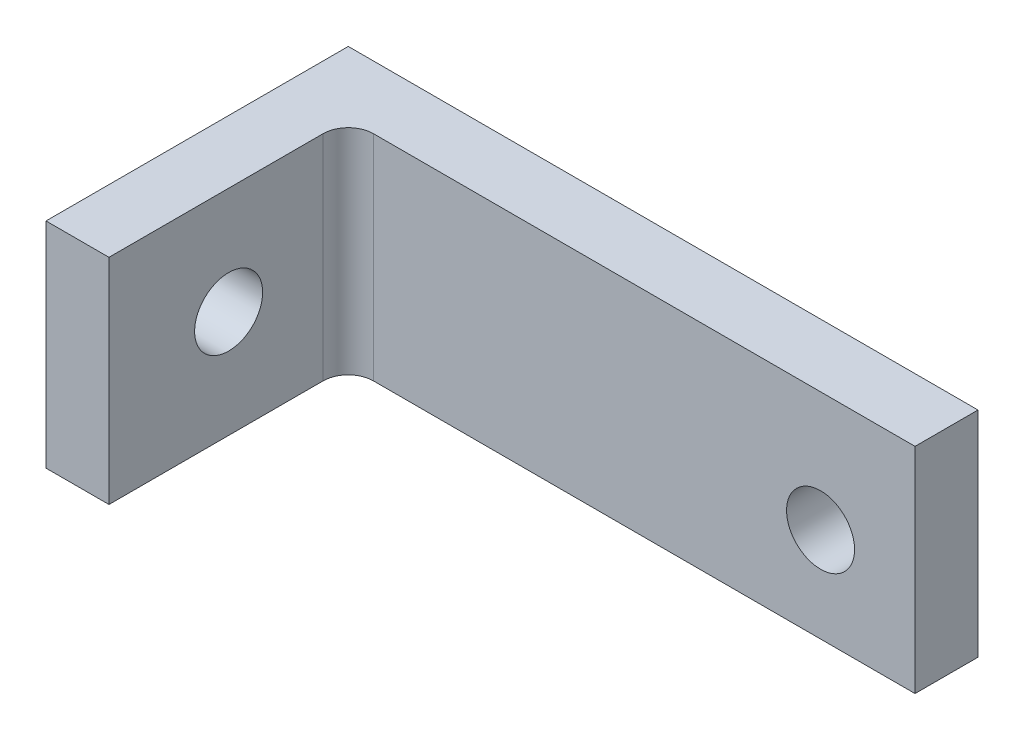
ISO-10303-21;
HEADER;
FILE_DESCRIPTION(('STEP AP214'),'2;1');
FILE_NAME('part.step','',(''),(''),'','','');
FILE_SCHEMA(('AUTOMOTIVE_DESIGN { 1 0 10303 214 1 1 1 1 }'));
ENDSEC;
DATA;
#1=APPLICATION_CONTEXT('core data for automotive mechanical design processes');
#2=APPLICATION_PROTOCOL_DEFINITION('international standard','automotive_design',2000,#1);
#3=PRODUCT_CONTEXT('',#1,'mechanical');
#4=PRODUCT('Part','Part','',(#3));
#5=PRODUCT_RELATED_PRODUCT_CATEGORY('part','',(#4));
#6=PRODUCT_DEFINITION_FORMATION('','',#4);
#7=PRODUCT_DEFINITION_CONTEXT('part definition',#1,'design');
#8=PRODUCT_DEFINITION('design','',#6,#7);
#9=PRODUCT_DEFINITION_SHAPE('','',#8);
#10=(LENGTH_UNIT() NAMED_UNIT(*) SI_UNIT(.MILLI.,.METRE.));
#11=(NAMED_UNIT(*) PLANE_ANGLE_UNIT() SI_UNIT($,.RADIAN.));
#12=(NAMED_UNIT(*) SI_UNIT($,.STERADIAN.) SOLID_ANGLE_UNIT());
#13=UNCERTAINTY_MEASURE_WITH_UNIT(LENGTH_MEASURE(1.E-05),#10,'distance_accuracy_value','');
#14=(GEOMETRIC_REPRESENTATION_CONTEXT(3) GLOBAL_UNCERTAINTY_ASSIGNED_CONTEXT((#13)) GLOBAL_UNIT_ASSIGNED_CONTEXT((#10,
#11,#12)) REPRESENTATION_CONTEXT('',''));
#15=CARTESIAN_POINT('',(0.,0.,0.));
#16=DIRECTION('',(0.,0.,1.));
#17=DIRECTION('',(1.,0.,0.));
#18=AXIS2_PLACEMENT_3D('',#15,#16,#17);
#19=CARTESIAN_POINT('',(-25.,17.,0.));
#20=DIRECTION('',(1.,0.,0.));
#21=DIRECTION('',(0.,0.,-1.));
#22=AXIS2_PLACEMENT_3D('',#19,#20,#21);
#23=PLANE('',#22);
#24=CARTESIAN_POINT('',(-25.,8.5,14.5));
#25=DIRECTION('',(1.,0.,0.));
#26=DIRECTION('',(0.,0.,-1.));
#27=AXIS2_PLACEMENT_3D('',#24,#25,#26);
#28=CIRCLE('',#27,2.7);
#29=CARTESIAN_POINT('',(-25.,8.5,11.8));
#30=VERTEX_POINT('',#29);
#31=EDGE_CURVE('E146',#30,#30,#28,.T.);
#32=ORIENTED_EDGE('',*,*,#31,.T.);
#33=EDGE_LOOP('',(#32));
#34=FACE_BOUND('',#33,.T.);
#35=DIRECTION('',(0.,0.,1.));
#36=VECTOR('',#35,1.);
#37=CARTESIAN_POINT('',(-25.,0.,0.));
#38=LINE('',#37,#36);
#39=CARTESIAN_POINT('',(-25.,0.,0.));
#40=VERTEX_POINT('',#39);
#41=CARTESIAN_POINT('',(-25.,0.,24.));
#42=VERTEX_POINT('',#41);
#43=EDGE_CURVE('E120',#40,#42,#38,.T.);
#44=ORIENTED_EDGE('',*,*,#43,.T.);
#45=DIRECTION('',(0.,-1.,0.));
#46=VECTOR('',#45,1.);
#47=CARTESIAN_POINT('',(-25.,17.,24.));
#48=LINE('',#47,#46);
#49=CARTESIAN_POINT('',(-25.,17.,24.));
#50=VERTEX_POINT('',#49);
#51=EDGE_CURVE('E102',#50,#42,#48,.T.);
#52=ORIENTED_EDGE('',*,*,#51,.F.);
#53=DIRECTION('',(0.,0.,1.));
#54=VECTOR('',#53,1.);
#55=CARTESIAN_POINT('',(-25.,17.,0.));
#56=LINE('',#55,#54);
#57=CARTESIAN_POINT('',(-25.,17.,0.));
#58=VERTEX_POINT('',#57);
#59=EDGE_CURVE('E108',#58,#50,#56,.T.);
#60=ORIENTED_EDGE('',*,*,#59,.F.);
#61=DIRECTION('',(0.,-1.,0.));
#62=VECTOR('',#61,1.);
#63=CARTESIAN_POINT('',(-25.,17.,0.));
#64=LINE('',#63,#62);
#65=EDGE_CURVE('E134',#58,#40,#64,.T.);
#66=ORIENTED_EDGE('',*,*,#65,.T.);
#67=EDGE_LOOP('',(#44,#52,#60,#66));
#68=FACE_BOUND('',#67,.T.);
#69=ADVANCED_FACE('F39',(#34,#68),#23,.F.);
#70=CARTESIAN_POINT('',(-25.,17.,24.));
#71=DIRECTION('',(0.,0.,-1.));
#72=DIRECTION('',(-1.,0.,0.));
#73=AXIS2_PLACEMENT_3D('',#70,#71,#72);
#74=PLANE('',#73);
#75=DIRECTION('',(1.,0.,0.));
#76=VECTOR('',#75,1.);
#77=CARTESIAN_POINT('',(-25.,0.,24.));
#78=LINE('',#77,#76);
#79=CARTESIAN_POINT('',(-20.,0.,24.));
#80=VERTEX_POINT('',#79);
#81=EDGE_CURVE('E143',#42,#80,#78,.T.);
#82=ORIENTED_EDGE('',*,*,#81,.T.);
#83=DIRECTION('',(0.,-1.,0.));
#84=VECTOR('',#83,1.);
#85=CARTESIAN_POINT('',(-20.,17.,24.));
#86=LINE('',#85,#84);
#87=CARTESIAN_POINT('',(-20.,17.,24.));
#88=VERTEX_POINT('',#87);
#89=EDGE_CURVE('E105',#88,#80,#86,.T.);
#90=ORIENTED_EDGE('',*,*,#89,.F.);
#91=DIRECTION('',(1.,0.,0.));
#92=VECTOR('',#91,1.);
#93=CARTESIAN_POINT('',(-25.,17.,24.));
#94=LINE('',#93,#92);
#95=EDGE_CURVE('E98',#50,#88,#94,.T.);
#96=ORIENTED_EDGE('',*,*,#95,.F.);
#97=ORIENTED_EDGE('',*,*,#51,.T.);
#98=EDGE_LOOP('',(#82,#90,#96,#97));
#99=FACE_BOUND('',#98,.T.);
#100=ADVANCED_FACE('F100',(#99),#74,.F.);
#101=CARTESIAN_POINT('',(-20.,17.,24.));
#102=DIRECTION('',(-1.,0.,0.));
#103=DIRECTION('',(0.,0.,1.));
#104=AXIS2_PLACEMENT_3D('',#101,#102,#103);
#105=PLANE('',#104);
#106=CARTESIAN_POINT('',(-20.,8.5,14.5));
#107=DIRECTION('',(1.,0.,0.));
#108=DIRECTION('',(0.,0.,-1.));
#109=AXIS2_PLACEMENT_3D('',#106,#107,#108);
#110=CIRCLE('',#109,2.7);
#111=CARTESIAN_POINT('',(-20.,8.5,11.8));
#112=VERTEX_POINT('',#111);
#113=EDGE_CURVE('E153',#112,#112,#110,.T.);
#114=ORIENTED_EDGE('',*,*,#113,.F.);
#115=EDGE_LOOP('',(#114));
#116=FACE_BOUND('',#115,.T.);
#117=DIRECTION('',(0.,0.,-1.));
#118=VECTOR('',#117,1.);
#119=CARTESIAN_POINT('',(-20.,0.,24.));
#120=LINE('',#119,#118);
#121=CARTESIAN_POINT('',(-20.,0.,7.));
#122=VERTEX_POINT('',#121);
#123=EDGE_CURVE('E141',#80,#122,#120,.T.);
#124=ORIENTED_EDGE('',*,*,#123,.T.);
#125=DIRECTION('',(0.,-1.,0.));
#126=VECTOR('',#125,1.);
#127=CARTESIAN_POINT('',(-20.,17.,7.));
#128=LINE('',#127,#126);
#129=CARTESIAN_POINT('',(-20.,17.,7.));
#130=VERTEX_POINT('',#129);
#131=EDGE_CURVE('E54',#122,#130,#128,.F.);
#132=ORIENTED_EDGE('',*,*,#131,.T.);
#133=DIRECTION('',(0.,0.,-1.));
#134=VECTOR('',#133,1.);
#135=CARTESIAN_POINT('',(-20.,17.,24.));
#136=LINE('',#135,#134);
#137=EDGE_CURVE('E107',#88,#130,#136,.T.);
#138=ORIENTED_EDGE('',*,*,#137,.F.);
#139=ORIENTED_EDGE('',*,*,#89,.T.);
#140=EDGE_LOOP('',(#124,#132,#138,#139));
#141=FACE_BOUND('',#140,.T.);
#142=ADVANCED_FACE('F179',(#116,#141),#105,.F.);
#143=CARTESIAN_POINT('',(-20.,17.,5.));
#144=DIRECTION('',(0.,0.,-1.));
#145=DIRECTION('',(-1.,0.,0.));
#146=AXIS2_PLACEMENT_3D('',#143,#144,#145);
#147=PLANE('',#146);
#148=CARTESIAN_POINT('',(17.5,7.5,5.));
#149=DIRECTION('',(0.,0.,1.));
#150=DIRECTION('',(1.,0.,0.));
#151=AXIS2_PLACEMENT_3D('',#148,#149,#150);
#152=CIRCLE('',#151,2.7);
#153=CARTESIAN_POINT('',(20.2,7.5,5.));
#154=VERTEX_POINT('',#153);
#155=EDGE_CURVE('E159',#154,#154,#152,.T.);
#156=ORIENTED_EDGE('',*,*,#155,.F.);
#157=EDGE_LOOP('',(#156));
#158=FACE_BOUND('',#157,.T.);
#159=DIRECTION('',(1.,0.,0.));
#160=VECTOR('',#159,1.);
#161=CARTESIAN_POINT('',(-20.,17.,5.));
#162=LINE('',#161,#160);
#163=CARTESIAN_POINT('',(-18.,17.,5.));
#164=VERTEX_POINT('',#163);
#165=CARTESIAN_POINT('',(25.,17.,5.));
#166=VERTEX_POINT('',#165);
#167=EDGE_CURVE('E150',#164,#166,#162,.T.);
#168=ORIENTED_EDGE('',*,*,#167,.F.);
#169=DIRECTION('',(0.,-1.,0.));
#170=VECTOR('',#169,1.);
#171=CARTESIAN_POINT('',(-18.,0.,5.));
#172=LINE('',#171,#170);
#173=CARTESIAN_POINT('',(-18.,0.,5.));
#174=VERTEX_POINT('',#173);
#175=EDGE_CURVE('E121',#164,#174,#172,.T.);
#176=ORIENTED_EDGE('',*,*,#175,.T.);
#177=DIRECTION('',(1.,0.,0.));
#178=VECTOR('',#177,1.);
#179=CARTESIAN_POINT('',(-20.,0.,5.));
#180=LINE('',#179,#178);
#181=CARTESIAN_POINT('',(25.,0.,5.));
#182=VERTEX_POINT('',#181);
#183=EDGE_CURVE('E139',#174,#182,#180,.T.);
#184=ORIENTED_EDGE('',*,*,#183,.T.);
#185=DIRECTION('',(0.,-1.,0.));
#186=VECTOR('',#185,1.);
#187=CARTESIAN_POINT('',(25.,17.,5.));
#188=LINE('',#187,#186);
#189=EDGE_CURVE('E125',#166,#182,#188,.T.);
#190=ORIENTED_EDGE('',*,*,#189,.F.);
#191=EDGE_LOOP('',(#168,#176,#184,#190));
#192=FACE_BOUND('',#191,.T.);
#193=ADVANCED_FACE('F175',(#158,#192),#147,.F.);
#194=CARTESIAN_POINT('',(25.,17.,0.));
#195=DIRECTION('',(-1.,0.,0.));
#196=DIRECTION('',(0.,0.,1.));
#197=AXIS2_PLACEMENT_3D('',#194,#195,#196);
#198=PLANE('',#197);
#199=DIRECTION('',(0.,0.,-1.));
#200=VECTOR('',#199,1.);
#201=CARTESIAN_POINT('',(25.,0.,0.));
#202=LINE('',#201,#200);
#203=CARTESIAN_POINT('',(25.,0.,0.));
#204=VERTEX_POINT('',#203);
#205=EDGE_CURVE('E137',#182,#204,#202,.T.);
#206=ORIENTED_EDGE('',*,*,#205,.T.);
#207=DIRECTION('',(0.,-1.,0.));
#208=VECTOR('',#207,1.);
#209=CARTESIAN_POINT('',(25.,17.,0.));
#210=LINE('',#209,#208);
#211=CARTESIAN_POINT('',(25.,17.,0.));
#212=VERTEX_POINT('',#211);
#213=EDGE_CURVE('E131',#212,#204,#210,.T.);
#214=ORIENTED_EDGE('',*,*,#213,.F.);
#215=DIRECTION('',(0.,0.,-1.));
#216=VECTOR('',#215,1.);
#217=CARTESIAN_POINT('',(25.,17.,0.));
#218=LINE('',#217,#216);
#219=EDGE_CURVE('E148',#166,#212,#218,.T.);
#220=ORIENTED_EDGE('',*,*,#219,.F.);
#221=ORIENTED_EDGE('',*,*,#189,.T.);
#222=EDGE_LOOP('',(#206,#214,#220,#221));
#223=FACE_BOUND('',#222,.T.);
#224=ADVANCED_FACE('F178',(#223),#198,.F.);
#225=CARTESIAN_POINT('',(-25.,17.,0.));
#226=DIRECTION('',(0.,0.,1.));
#227=DIRECTION('',(1.,0.,0.));
#228=AXIS2_PLACEMENT_3D('',#225,#226,#227);
#229=PLANE('',#228);
#230=CARTESIAN_POINT('',(17.5,7.5,0.));
#231=DIRECTION('',(0.,0.,1.));
#232=DIRECTION('',(1.,0.,0.));
#233=AXIS2_PLACEMENT_3D('',#230,#231,#232);
#234=CIRCLE('',#233,2.7);
#235=CARTESIAN_POINT('',(20.2,7.5,0.));
#236=VERTEX_POINT('',#235);
#237=EDGE_CURVE('E156',#236,#236,#234,.T.);
#238=ORIENTED_EDGE('',*,*,#237,.T.);
#239=EDGE_LOOP('',(#238));
#240=FACE_BOUND('',#239,.T.);
#241=DIRECTION('',(-1.,0.,0.));
#242=VECTOR('',#241,1.);
#243=CARTESIAN_POINT('',(-25.,0.,0.));
#244=LINE('',#243,#242);
#245=EDGE_CURVE('E117',#204,#40,#244,.T.);
#246=ORIENTED_EDGE('',*,*,#245,.T.);
#247=ORIENTED_EDGE('',*,*,#65,.F.);
#248=DIRECTION('',(-1.,0.,0.));
#249=VECTOR('',#248,1.);
#250=CARTESIAN_POINT('',(-25.,17.,0.));
#251=LINE('',#250,#249);
#252=EDGE_CURVE('E113',#212,#58,#251,.T.);
#253=ORIENTED_EDGE('',*,*,#252,.F.);
#254=ORIENTED_EDGE('',*,*,#213,.T.);
#255=EDGE_LOOP('',(#246,#247,#253,#254));
#256=FACE_BOUND('',#255,.T.);
#257=ADVANCED_FACE('F165',(#240,#256),#229,.F.);
#258=CARTESIAN_POINT('',(0.,17.,0.));
#259=DIRECTION('',(0.,1.,0.));
#260=DIRECTION('',(0.,0.,1.));
#261=AXIS2_PLACEMENT_3D('',#258,#259,#260);
#262=PLANE('',#261);
#263=ORIENTED_EDGE('',*,*,#59,.T.);
#264=ORIENTED_EDGE('',*,*,#95,.T.);
#265=ORIENTED_EDGE('',*,*,#137,.T.);
#266=CARTESIAN_POINT('',(-18.,17.,7.));
#267=DIRECTION('',(0.,1.,0.));
#268=DIRECTION('',(0.,0.,1.));
#269=AXIS2_PLACEMENT_3D('',#266,#267,#268);
#270=CIRCLE('',#269,2.);
#271=EDGE_CURVE('E11',#130,#164,#270,.F.);
#272=ORIENTED_EDGE('',*,*,#271,.T.);
#273=ORIENTED_EDGE('',*,*,#167,.T.);
#274=ORIENTED_EDGE('',*,*,#219,.T.);
#275=ORIENTED_EDGE('',*,*,#252,.T.);
#276=EDGE_LOOP('',(#263,#264,#265,#272,#273,#274,#275));
#277=FACE_BOUND('',#276,.T.);
#278=ADVANCED_FACE('F111',(#277),#262,.T.);
#279=CARTESIAN_POINT('',(0.,0.,0.));
#280=DIRECTION('',(0.,1.,0.));
#281=DIRECTION('',(0.,0.,1.));
#282=AXIS2_PLACEMENT_3D('',#279,#280,#281);
#283=PLANE('',#282);
#284=ORIENTED_EDGE('',*,*,#43,.F.);
#285=ORIENTED_EDGE('',*,*,#245,.F.);
#286=ORIENTED_EDGE('',*,*,#205,.F.);
#287=ORIENTED_EDGE('',*,*,#183,.F.);
#288=CARTESIAN_POINT('',(-18.,0.,7.));
#289=DIRECTION('',(0.,1.,0.));
#290=DIRECTION('',(0.,0.,1.));
#291=AXIS2_PLACEMENT_3D('',#288,#289,#290);
#292=CIRCLE('',#291,2.);
#293=EDGE_CURVE('E47',#174,#122,#292,.T.);
#294=ORIENTED_EDGE('',*,*,#293,.T.);
#295=ORIENTED_EDGE('',*,*,#123,.F.);
#296=ORIENTED_EDGE('',*,*,#81,.F.);
#297=EDGE_LOOP('',(#284,#285,#286,#287,#294,#295,#296));
#298=FACE_BOUND('',#297,.T.);
#299=ADVANCED_FACE('F187',(#298),#283,.F.);
#300=CARTESIAN_POINT('',(-25.,8.5,14.5));
#301=DIRECTION('',(1.,0.,0.));
#302=DIRECTION('',(0.,0.,-1.));
#303=AXIS2_PLACEMENT_3D('',#300,#301,#302);
#304=CYLINDRICAL_SURFACE('',#303,2.7);
#305=ORIENTED_EDGE('',*,*,#31,.F.);
#306=EDGE_LOOP('',(#305));
#307=FACE_BOUND('',#306,.T.);
#308=ORIENTED_EDGE('',*,*,#113,.T.);
#309=EDGE_LOOP('',(#308));
#310=FACE_BOUND('',#309,.T.);
#311=ADVANCED_FACE('F171',(#307,#310),#304,.F.);
#312=CARTESIAN_POINT('',(17.5,7.5,0.));
#313=DIRECTION('',(0.,0.,1.));
#314=DIRECTION('',(1.,0.,0.));
#315=AXIS2_PLACEMENT_3D('',#312,#313,#314);
#316=CYLINDRICAL_SURFACE('',#315,2.7);
#317=ORIENTED_EDGE('',*,*,#237,.F.);
#318=EDGE_LOOP('',(#317));
#319=FACE_BOUND('',#318,.T.);
#320=ORIENTED_EDGE('',*,*,#155,.T.);
#321=EDGE_LOOP('',(#320));
#322=FACE_BOUND('',#321,.T.);
#323=ADVANCED_FACE('F168',(#319,#322),#316,.F.);
#324=CARTESIAN_POINT('',(-18.,17.,7.));
#325=DIRECTION('',(0.,1.,0.));
#326=DIRECTION('',(0.,0.,1.));
#327=AXIS2_PLACEMENT_3D('',#324,#325,#326);
#328=CYLINDRICAL_SURFACE('',#327,2.);
#329=ORIENTED_EDGE('',*,*,#271,.F.);
#330=ORIENTED_EDGE('',*,*,#131,.F.);
#331=ORIENTED_EDGE('',*,*,#293,.F.);
#332=ORIENTED_EDGE('',*,*,#175,.F.);
#333=EDGE_LOOP('',(#329,#330,#331,#332));
#334=FACE_BOUND('',#333,.T.);
#335=ADVANCED_FACE('F41',(#334),#328,.F.);
#336=CLOSED_SHELL('',(#69,#100,#142,#193,#224,#257,#278,#299,#311,#323,#335));
#337=MANIFOLD_SOLID_BREP('B2',#336);
#338=ADVANCED_BREP_SHAPE_REPRESENTATION('',(#18,#337),#14);
#339=SHAPE_DEFINITION_REPRESENTATION(#9,#338);
ENDSEC;
END-ISO-10303-21;
